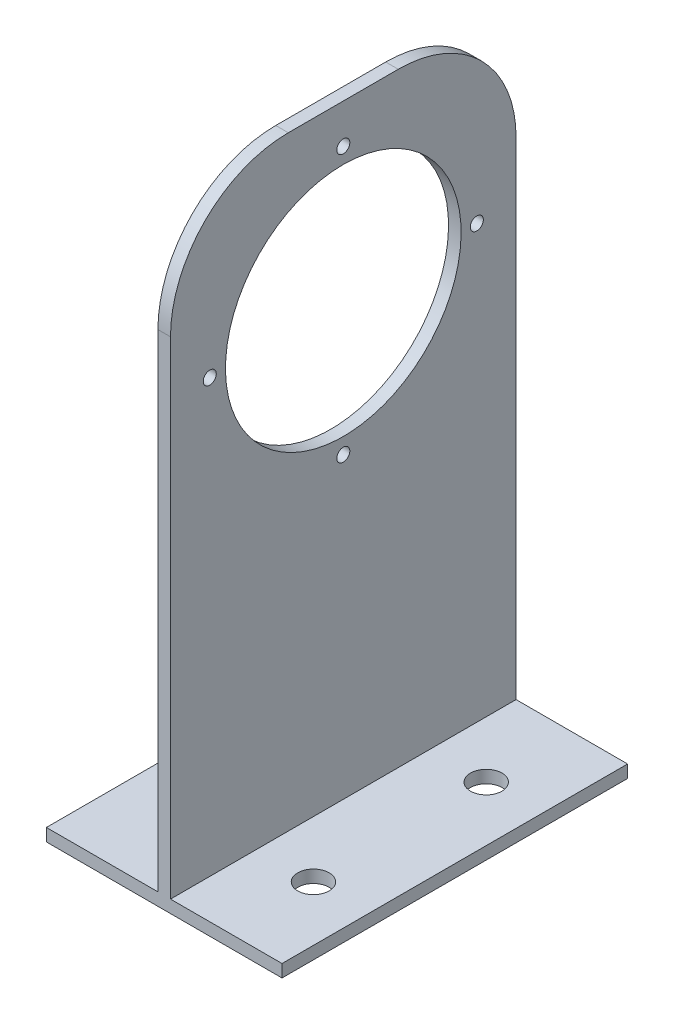
ISO-10303-21;
HEADER;
FILE_DESCRIPTION(('STEP AP214'),'2;1');
FILE_NAME('part.step','',(''),(''),'','','');
FILE_SCHEMA(('AUTOMOTIVE_DESIGN { 1 0 10303 214 1 1 1 1 }'));
ENDSEC;
DATA;
#1=APPLICATION_CONTEXT('core data for automotive mechanical design processes');
#2=APPLICATION_PROTOCOL_DEFINITION('international standard','automotive_design',2000,#1);
#3=PRODUCT_CONTEXT('',#1,'mechanical');
#4=PRODUCT('Part','Part','',(#3));
#5=PRODUCT_RELATED_PRODUCT_CATEGORY('part','',(#4));
#6=PRODUCT_DEFINITION_FORMATION('','',#4);
#7=PRODUCT_DEFINITION_CONTEXT('part definition',#1,'design');
#8=PRODUCT_DEFINITION('design','',#6,#7);
#9=PRODUCT_DEFINITION_SHAPE('','',#8);
#10=(LENGTH_UNIT() NAMED_UNIT(*) SI_UNIT(.MILLI.,.METRE.));
#11=(NAMED_UNIT(*) PLANE_ANGLE_UNIT() SI_UNIT($,.RADIAN.));
#12=(NAMED_UNIT(*) SI_UNIT($,.STERADIAN.) SOLID_ANGLE_UNIT());
#13=UNCERTAINTY_MEASURE_WITH_UNIT(LENGTH_MEASURE(1.E-05),#10,'distance_accuracy_value','');
#14=(GEOMETRIC_REPRESENTATION_CONTEXT(3) GLOBAL_UNCERTAINTY_ASSIGNED_CONTEXT((#13)) GLOBAL_UNIT_ASSIGNED_CONTEXT((#10,
#11,#12)) REPRESENTATION_CONTEXT('',''));
#15=CARTESIAN_POINT('',(0.,0.,0.));
#16=DIRECTION('',(0.,0.,1.));
#17=DIRECTION('',(1.,0.,0.));
#18=AXIS2_PLACEMENT_3D('',#15,#16,#17);
#19=CARTESIAN_POINT('',(3.99999999999999,393.,220.));
#20=DIRECTION('',(0.,-1.,0.));
#21=DIRECTION('',(0.,0.,-1.));
#22=AXIS2_PLACEMENT_3D('',#19,#20,#21);
#23=PLANE('',#22);
#24=DIRECTION('',(0.,0.,-1.));
#25=VECTOR('',#24,1.);
#26=CARTESIAN_POINT('',(3.99999999999999,393.,220.));
#27=LINE('',#26,#25);
#28=CARTESIAN_POINT('',(3.99999999999999,393.,145.));
#29=VERTEX_POINT('',#28);
#30=CARTESIAN_POINT('',(3.99999999999999,393.,75.));
#31=VERTEX_POINT('',#30);
#32=EDGE_CURVE('E164',#29,#31,#27,.T.);
#33=ORIENTED_EDGE('',*,*,#32,.T.);
#34=DIRECTION('',(-1.,0.,0.));
#35=VECTOR('',#34,1.);
#36=CARTESIAN_POINT('',(3.99999999999999,393.,75.));
#37=LINE('',#36,#35);
#38=CARTESIAN_POINT('',(-4.00000000000001,393.,75.));
#39=VERTEX_POINT('',#38);
#40=EDGE_CURVE('E222',#31,#39,#37,.T.);
#41=ORIENTED_EDGE('',*,*,#40,.T.);
#42=DIRECTION('',(0.,0.,-1.));
#43=VECTOR('',#42,1.);
#44=CARTESIAN_POINT('',(-4.00000000000001,393.,220.));
#45=LINE('',#44,#43);
#46=CARTESIAN_POINT('',(-4.00000000000001,393.,145.));
#47=VERTEX_POINT('',#46);
#48=EDGE_CURVE('E139',#47,#39,#45,.T.);
#49=ORIENTED_EDGE('',*,*,#48,.F.);
#50=DIRECTION('',(-1.,0.,0.));
#51=VECTOR('',#50,1.);
#52=CARTESIAN_POINT('',(3.99999999999999,393.,145.));
#53=LINE('',#52,#51);
#54=EDGE_CURVE('E208',#47,#29,#53,.F.);
#55=ORIENTED_EDGE('',*,*,#54,.T.);
#56=EDGE_LOOP('',(#33,#41,#49,#55));
#57=FACE_BOUND('',#56,.T.);
#58=ADVANCED_FACE('F39',(#57),#23,.F.);
#59=CARTESIAN_POINT('',(-4.00000000000001,393.,220.));
#60=DIRECTION('',(1.,0.,0.));
#61=DIRECTION('',(0.,1.,0.));
#62=AXIS2_PLACEMENT_3D('',#59,#60,#61);
#63=PLANE('',#62);
#64=CARTESIAN_POINT('',(-4.00000000000001,368.,110.));
#65=DIRECTION('',(1.,0.,0.));
#66=DIRECTION('',(0.,1.,0.));
#67=AXIS2_PLACEMENT_3D('',#64,#65,#66);
#68=CIRCLE('',#67,4.14999999999996);
#69=CARTESIAN_POINT('',(-4.00000000000001,372.15,110.));
#70=VERTEX_POINT('',#69);
#71=EDGE_CURVE('E340',#70,#70,#68,.T.);
#72=ORIENTED_EDGE('',*,*,#71,.T.);
#73=EDGE_LOOP('',(#72));
#74=FACE_BOUND('',#73,.T.);
#75=CARTESIAN_POINT('',(-4.00000000000002,283.,195.));
#76=DIRECTION('',(1.,0.,0.));
#77=DIRECTION('',(0.,1.,0.));
#78=AXIS2_PLACEMENT_3D('',#75,#76,#77);
#79=CIRCLE('',#78,4.14999999999996);
#80=CARTESIAN_POINT('',(-4.00000000000002,287.15,195.));
#81=VERTEX_POINT('',#80);
#82=EDGE_CURVE('E347',#81,#81,#79,.T.);
#83=ORIENTED_EDGE('',*,*,#82,.T.);
#84=EDGE_LOOP('',(#83));
#85=FACE_BOUND('',#84,.T.);
#86=CARTESIAN_POINT('',(-4.00000000000002,198.,110.));
#87=DIRECTION('',(1.,0.,0.));
#88=DIRECTION('',(0.,1.,0.));
#89=AXIS2_PLACEMENT_3D('',#86,#87,#88);
#90=CIRCLE('',#89,4.14999999999996);
#91=CARTESIAN_POINT('',(-4.00000000000002,202.15,110.));
#92=VERTEX_POINT('',#91);
#93=EDGE_CURVE('E358',#92,#92,#90,.T.);
#94=ORIENTED_EDGE('',*,*,#93,.T.);
#95=EDGE_LOOP('',(#94));
#96=FACE_BOUND('',#95,.T.);
#97=CARTESIAN_POINT('',(-4.00000000000002,283.,25.));
#98=DIRECTION('',(1.,0.,0.));
#99=DIRECTION('',(0.,1.,0.));
#100=AXIS2_PLACEMENT_3D('',#97,#98,#99);
#101=CIRCLE('',#100,4.14999999999996);
#102=CARTESIAN_POINT('',(-4.00000000000002,287.15,25.));
#103=VERTEX_POINT('',#102);
#104=EDGE_CURVE('E366',#103,#103,#101,.T.);
#105=ORIENTED_EDGE('',*,*,#104,.T.);
#106=EDGE_LOOP('',(#105));
#107=FACE_BOUND('',#106,.T.);
#108=CARTESIAN_POINT('',(-4.00000000000003,283.,110.));
#109=DIRECTION('',(1.,0.,0.));
#110=DIRECTION('',(0.,1.,0.));
#111=AXIS2_PLACEMENT_3D('',#108,#109,#110);
#112=CIRCLE('',#111,75.);
#113=CARTESIAN_POINT('',(-4.00000000000002,358.,110.));
#114=VERTEX_POINT('',#113);
#115=EDGE_CURVE('E374',#114,#114,#112,.T.);
#116=ORIENTED_EDGE('',*,*,#115,.T.);
#117=EDGE_LOOP('',(#116));
#118=FACE_BOUND('',#117,.T.);
#119=ORIENTED_EDGE('',*,*,#48,.T.);
#120=CARTESIAN_POINT('',(-4.00000000000002,318.,75.));
#121=DIRECTION('',(1.,0.,0.));
#122=DIRECTION('',(0.,1.,0.));
#123=AXIS2_PLACEMENT_3D('',#120,#121,#122);
#124=CIRCLE('',#123,75.);
#125=CARTESIAN_POINT('',(-4.00000000000002,318.,0.));
#126=VERTEX_POINT('',#125);
#127=EDGE_CURVE('E229',#39,#126,#124,.F.);
#128=ORIENTED_EDGE('',*,*,#127,.T.);
#129=DIRECTION('',(0.,-1.,0.));
#130=VECTOR('',#129,1.);
#131=CARTESIAN_POINT('',(-4.00000000000001,393.,0.));
#132=LINE('',#131,#130);
#133=CARTESIAN_POINT('',(-4.00000000000004,8.,0.));
#134=VERTEX_POINT('',#133);
#135=EDGE_CURVE('E135',#126,#134,#132,.T.);
#136=ORIENTED_EDGE('',*,*,#135,.T.);
#137=DIRECTION('',(0.,0.,-1.));
#138=VECTOR('',#137,1.);
#139=CARTESIAN_POINT('',(-4.00000000000004,8.,220.));
#140=LINE('',#139,#138);
#141=CARTESIAN_POINT('',(-4.00000000000004,8.,220.));
#142=VERTEX_POINT('',#141);
#143=EDGE_CURVE('E132',#142,#134,#140,.T.);
#144=ORIENTED_EDGE('',*,*,#143,.F.);
#145=DIRECTION('',(0.,-1.,0.));
#146=VECTOR('',#145,1.);
#147=CARTESIAN_POINT('',(-4.00000000000001,393.,220.));
#148=LINE('',#147,#146);
#149=CARTESIAN_POINT('',(-4.00000000000002,318.,220.));
#150=VERTEX_POINT('',#149);
#151=EDGE_CURVE('E120',#150,#142,#148,.T.);
#152=ORIENTED_EDGE('',*,*,#151,.F.);
#153=CARTESIAN_POINT('',(-4.00000000000002,318.,145.));
#154=DIRECTION('',(1.,0.,0.));
#155=DIRECTION('',(0.,1.,0.));
#156=AXIS2_PLACEMENT_3D('',#153,#154,#155);
#157=CIRCLE('',#156,75.);
#158=EDGE_CURVE('E226',#150,#47,#157,.F.);
#159=ORIENTED_EDGE('',*,*,#158,.T.);
#160=EDGE_LOOP('',(#119,#128,#136,#144,#152,#159));
#161=FACE_BOUND('',#160,.T.);
#162=ADVANCED_FACE('F134',(#74,#85,#96,#107,#118,#161),#63,.F.);
#163=CARTESIAN_POINT('',(-4.00000000000004,8.,220.));
#164=DIRECTION('',(0.,-1.,0.));
#165=DIRECTION('',(1.,0.,0.));
#166=AXIS2_PLACEMENT_3D('',#163,#164,#165);
#167=PLANE('',#166);
#168=CARTESIAN_POINT('',(-40.,7.99999999999999,165.));
#169=DIRECTION('',(0.,-1.,0.));
#170=DIRECTION('',(1.,0.,0.));
#171=AXIS2_PLACEMENT_3D('',#168,#169,#170);
#172=CIRCLE('',#171,9.99999999999994);
#173=CARTESIAN_POINT('',(-30.0000000000001,8.,165.));
#174=VERTEX_POINT('',#173);
#175=EDGE_CURVE('E387',#174,#174,#172,.T.);
#176=ORIENTED_EDGE('',*,*,#175,.T.);
#177=EDGE_LOOP('',(#176));
#178=FACE_BOUND('',#177,.T.);
#179=CARTESIAN_POINT('',(-40.,7.99999999999999,55.));
#180=DIRECTION('',(0.,-1.,0.));
#181=DIRECTION('',(1.,0.,0.));
#182=AXIS2_PLACEMENT_3D('',#179,#180,#181);
#183=CIRCLE('',#182,9.99999999999994);
#184=CARTESIAN_POINT('',(-30.,8.,55.));
#185=VERTEX_POINT('',#184);
#186=EDGE_CURVE('E168',#185,#185,#183,.T.);
#187=ORIENTED_EDGE('',*,*,#186,.T.);
#188=EDGE_LOOP('',(#187));
#189=FACE_BOUND('',#188,.T.);
#190=DIRECTION('',(-1.,0.,0.));
#191=VECTOR('',#190,1.);
#192=CARTESIAN_POINT('',(-4.00000000000004,8.,0.));
#193=LINE('',#192,#191);
#194=CARTESIAN_POINT('',(-75.,7.99999999999999,0.));
#195=VERTEX_POINT('',#194);
#196=EDGE_CURVE('E167',#134,#195,#193,.T.);
#197=ORIENTED_EDGE('',*,*,#196,.T.);
#198=DIRECTION('',(0.,0.,-1.));
#199=VECTOR('',#198,1.);
#200=CARTESIAN_POINT('',(-75.,7.99999999999999,220.));
#201=LINE('',#200,#199);
#202=CARTESIAN_POINT('',(-75.,7.99999999999999,220.));
#203=VERTEX_POINT('',#202);
#204=EDGE_CURVE('E140',#203,#195,#201,.T.);
#205=ORIENTED_EDGE('',*,*,#204,.F.);
#206=DIRECTION('',(-1.,0.,0.));
#207=VECTOR('',#206,1.);
#208=CARTESIAN_POINT('',(-4.00000000000004,8.,220.));
#209=LINE('',#208,#207);
#210=EDGE_CURVE('E124',#142,#203,#209,.T.);
#211=ORIENTED_EDGE('',*,*,#210,.F.);
#212=ORIENTED_EDGE('',*,*,#143,.T.);
#213=EDGE_LOOP('',(#197,#205,#211,#212));
#214=FACE_BOUND('',#213,.T.);
#215=ADVANCED_FACE('F142',(#178,#189,#214),#167,.F.);
#216=CARTESIAN_POINT('',(-75.,7.99999999999999,220.));
#217=DIRECTION('',(1.,0.,0.));
#218=DIRECTION('',(0.,1.,0.));
#219=AXIS2_PLACEMENT_3D('',#216,#217,#218);
#220=PLANE('',#219);
#221=DIRECTION('',(0.,-1.,0.));
#222=VECTOR('',#221,1.);
#223=CARTESIAN_POINT('',(-75.,7.99999999999999,0.));
#224=LINE('',#223,#222);
#225=CARTESIAN_POINT('',(-75.,0.,0.));
#226=VERTEX_POINT('',#225);
#227=EDGE_CURVE('E171',#195,#226,#224,.T.);
#228=ORIENTED_EDGE('',*,*,#227,.T.);
#229=DIRECTION('',(0.,0.,-1.));
#230=VECTOR('',#229,1.);
#231=CARTESIAN_POINT('',(-75.,0.,220.));
#232=LINE('',#231,#230);
#233=CARTESIAN_POINT('',(-75.,0.,220.));
#234=VERTEX_POINT('',#233);
#235=EDGE_CURVE('E200',#234,#226,#232,.T.);
#236=ORIENTED_EDGE('',*,*,#235,.F.);
#237=DIRECTION('',(0.,-1.,0.));
#238=VECTOR('',#237,1.);
#239=CARTESIAN_POINT('',(-75.,7.99999999999999,220.));
#240=LINE('',#239,#238);
#241=EDGE_CURVE('E146',#203,#234,#240,.T.);
#242=ORIENTED_EDGE('',*,*,#241,.F.);
#243=ORIENTED_EDGE('',*,*,#204,.T.);
#244=EDGE_LOOP('',(#228,#236,#242,#243));
#245=FACE_BOUND('',#244,.T.);
#246=ADVANCED_FACE('F248',(#245),#220,.F.);
#247=CARTESIAN_POINT('',(-75.,0.,220.));
#248=DIRECTION('',(0.,1.,0.));
#249=DIRECTION('',(-1.,0.,0.));
#250=AXIS2_PLACEMENT_3D('',#247,#248,#249);
#251=PLANE('',#250);
#252=CARTESIAN_POINT('',(40.,0.,55.));
#253=DIRECTION('',(0.,-1.,0.));
#254=DIRECTION('',(0.,0.,-1.));
#255=AXIS2_PLACEMENT_3D('',#252,#253,#254);
#256=CIRCLE('',#255,9.99999999999996);
#257=CARTESIAN_POINT('',(40.,0.,45.0000000000001));
#258=VERTEX_POINT('',#257);
#259=EDGE_CURVE('E219',#258,#258,#256,.T.);
#260=ORIENTED_EDGE('',*,*,#259,.F.);
#261=EDGE_LOOP('',(#260));
#262=FACE_BOUND('',#261,.T.);
#263=CARTESIAN_POINT('',(40.,0.,165.));
#264=DIRECTION('',(0.,-1.,0.));
#265=DIRECTION('',(0.,0.,-1.));
#266=AXIS2_PLACEMENT_3D('',#263,#264,#265);
#267=CIRCLE('',#266,9.99999999999996);
#268=CARTESIAN_POINT('',(40.,0.,155.));
#269=VERTEX_POINT('',#268);
#270=EDGE_CURVE('E214',#269,#269,#267,.T.);
#271=ORIENTED_EDGE('',*,*,#270,.F.);
#272=EDGE_LOOP('',(#271));
#273=FACE_BOUND('',#272,.T.);
#274=CARTESIAN_POINT('',(-40.,0.,165.));
#275=DIRECTION('',(0.,-1.,0.));
#276=DIRECTION('',(0.,0.,-1.));
#277=AXIS2_PLACEMENT_3D('',#274,#275,#276);
#278=CIRCLE('',#277,9.99999999999996);
#279=CARTESIAN_POINT('',(-40.,0.,155.));
#280=VERTEX_POINT('',#279);
#281=EDGE_CURVE('E213',#280,#280,#278,.T.);
#282=ORIENTED_EDGE('',*,*,#281,.F.);
#283=EDGE_LOOP('',(#282));
#284=FACE_BOUND('',#283,.T.);
#285=CARTESIAN_POINT('',(-40.,0.,55.));
#286=DIRECTION('',(0.,-1.,0.));
#287=DIRECTION('',(0.,0.,-1.));
#288=AXIS2_PLACEMENT_3D('',#285,#286,#287);
#289=CIRCLE('',#288,9.99999999999996);
#290=CARTESIAN_POINT('',(-40.,0.,45.));
#291=VERTEX_POINT('',#290);
#292=EDGE_CURVE('E391',#291,#291,#289,.T.);
#293=ORIENTED_EDGE('',*,*,#292,.F.);
#294=EDGE_LOOP('',(#293));
#295=FACE_BOUND('',#294,.T.);
#296=DIRECTION('',(1.,0.,0.));
#297=VECTOR('',#296,1.);
#298=CARTESIAN_POINT('',(-75.,0.,0.));
#299=LINE('',#298,#297);
#300=CARTESIAN_POINT('',(75.,0.,0.));
#301=VERTEX_POINT('',#300);
#302=EDGE_CURVE('E174',#226,#301,#299,.T.);
#303=ORIENTED_EDGE('',*,*,#302,.T.);
#304=DIRECTION('',(0.,0.,-1.));
#305=VECTOR('',#304,1.);
#306=CARTESIAN_POINT('',(75.,0.,220.));
#307=LINE('',#306,#305);
#308=CARTESIAN_POINT('',(75.,0.,220.));
#309=VERTEX_POINT('',#308);
#310=EDGE_CURVE('E196',#309,#301,#307,.T.);
#311=ORIENTED_EDGE('',*,*,#310,.F.);
#312=DIRECTION('',(1.,0.,0.));
#313=VECTOR('',#312,1.);
#314=CARTESIAN_POINT('',(-75.,0.,220.));
#315=LINE('',#314,#313);
#316=EDGE_CURVE('E149',#234,#309,#315,.T.);
#317=ORIENTED_EDGE('',*,*,#316,.F.);
#318=ORIENTED_EDGE('',*,*,#235,.T.);
#319=EDGE_LOOP('',(#303,#311,#317,#318));
#320=FACE_BOUND('',#319,.T.);
#321=ADVANCED_FACE('F255',(#262,#273,#284,#295,#320),#251,.F.);
#322=CARTESIAN_POINT('',(75.,0.,220.));
#323=DIRECTION('',(-1.,0.,0.));
#324=DIRECTION('',(0.,0.,1.));
#325=AXIS2_PLACEMENT_3D('',#322,#323,#324);
#326=PLANE('',#325);
#327=DIRECTION('',(0.,1.,0.));
#328=VECTOR('',#327,1.);
#329=CARTESIAN_POINT('',(75.,0.,0.));
#330=LINE('',#329,#328);
#331=CARTESIAN_POINT('',(75.,7.99999999999997,0.));
#332=VERTEX_POINT('',#331);
#333=EDGE_CURVE('E177',#301,#332,#330,.T.);
#334=ORIENTED_EDGE('',*,*,#333,.T.);
#335=DIRECTION('',(0.,0.,-1.));
#336=VECTOR('',#335,1.);
#337=CARTESIAN_POINT('',(75.,7.99999999999997,220.));
#338=LINE('',#337,#336);
#339=CARTESIAN_POINT('',(75.,7.99999999999997,220.));
#340=VERTEX_POINT('',#339);
#341=EDGE_CURVE('E192',#340,#332,#338,.T.);
#342=ORIENTED_EDGE('',*,*,#341,.F.);
#343=DIRECTION('',(0.,1.,0.));
#344=VECTOR('',#343,1.);
#345=CARTESIAN_POINT('',(75.,0.,220.));
#346=LINE('',#345,#344);
#347=EDGE_CURVE('E155',#309,#340,#346,.T.);
#348=ORIENTED_EDGE('',*,*,#347,.F.);
#349=ORIENTED_EDGE('',*,*,#310,.T.);
#350=EDGE_LOOP('',(#334,#342,#348,#349));
#351=FACE_BOUND('',#350,.T.);
#352=ADVANCED_FACE('F258',(#351),#326,.F.);
#353=CARTESIAN_POINT('',(75.,7.99999999999997,220.));
#354=DIRECTION('',(0.,-1.,0.));
#355=DIRECTION('',(1.,0.,0.));
#356=AXIS2_PLACEMENT_3D('',#353,#354,#355);
#357=PLANE('',#356);
#358=CARTESIAN_POINT('',(40.,7.99999999999998,55.));
#359=DIRECTION('',(0.,-1.,0.));
#360=DIRECTION('',(1.,0.,0.));
#361=AXIS2_PLACEMENT_3D('',#358,#359,#360);
#362=CIRCLE('',#361,9.99999999999994);
#363=CARTESIAN_POINT('',(49.9999999999999,7.99999999999998,55.));
#364=VERTEX_POINT('',#363);
#365=EDGE_CURVE('E215',#364,#364,#362,.T.);
#366=ORIENTED_EDGE('',*,*,#365,.T.);
#367=EDGE_LOOP('',(#366));
#368=FACE_BOUND('',#367,.T.);
#369=CARTESIAN_POINT('',(40.,7.99999999999998,165.));
#370=DIRECTION('',(0.,-1.,0.));
#371=DIRECTION('',(1.,0.,0.));
#372=AXIS2_PLACEMENT_3D('',#369,#370,#371);
#373=CIRCLE('',#372,9.99999999999994);
#374=CARTESIAN_POINT('',(49.9999999999999,7.99999999999998,165.));
#375=VERTEX_POINT('',#374);
#376=EDGE_CURVE('E209',#375,#375,#373,.T.);
#377=ORIENTED_EDGE('',*,*,#376,.T.);
#378=EDGE_LOOP('',(#377));
#379=FACE_BOUND('',#378,.T.);
#380=DIRECTION('',(-1.,0.,0.));
#381=VECTOR('',#380,1.);
#382=CARTESIAN_POINT('',(75.,7.99999999999997,0.));
#383=LINE('',#382,#381);
#384=CARTESIAN_POINT('',(4.00000000000004,8.,0.));
#385=VERTEX_POINT('',#384);
#386=EDGE_CURVE('E180',#332,#385,#383,.T.);
#387=ORIENTED_EDGE('',*,*,#386,.T.);
#388=DIRECTION('',(0.,0.,-1.));
#389=VECTOR('',#388,1.);
#390=CARTESIAN_POINT('',(4.00000000000004,8.,220.));
#391=LINE('',#390,#389);
#392=CARTESIAN_POINT('',(4.00000000000004,8.,220.));
#393=VERTEX_POINT('',#392);
#394=EDGE_CURVE('E188',#393,#385,#391,.T.);
#395=ORIENTED_EDGE('',*,*,#394,.F.);
#396=DIRECTION('',(-1.,0.,0.));
#397=VECTOR('',#396,1.);
#398=CARTESIAN_POINT('',(75.,7.99999999999997,220.));
#399=LINE('',#398,#397);
#400=EDGE_CURVE('E158',#340,#393,#399,.T.);
#401=ORIENTED_EDGE('',*,*,#400,.F.);
#402=ORIENTED_EDGE('',*,*,#341,.T.);
#403=EDGE_LOOP('',(#387,#395,#401,#402));
#404=FACE_BOUND('',#403,.T.);
#405=ADVANCED_FACE('F263',(#368,#379,#404),#357,.F.);
#406=CARTESIAN_POINT('',(4.00000000000004,8.,220.));
#407=DIRECTION('',(-1.,0.,0.));
#408=DIRECTION('',(0.,-1.,0.));
#409=AXIS2_PLACEMENT_3D('',#406,#407,#408);
#410=PLANE('',#409);
#411=CARTESIAN_POINT('',(3.99999999999999,368.,110.));
#412=DIRECTION('',(1.,0.,0.));
#413=DIRECTION('',(0.,0.,-1.));
#414=AXIS2_PLACEMENT_3D('',#411,#412,#413);
#415=CIRCLE('',#414,4.14999999999999);
#416=CARTESIAN_POINT('',(3.99999999999999,368.,105.85));
#417=VERTEX_POINT('',#416);
#418=EDGE_CURVE('E337',#417,#417,#415,.T.);
#419=ORIENTED_EDGE('',*,*,#418,.F.);
#420=EDGE_LOOP('',(#419));
#421=FACE_BOUND('',#420,.T.);
#422=CARTESIAN_POINT('',(4.,283.,195.));
#423=DIRECTION('',(1.,0.,0.));
#424=DIRECTION('',(0.,0.,-1.));
#425=AXIS2_PLACEMENT_3D('',#422,#423,#424);
#426=CIRCLE('',#425,4.14999999999999);
#427=CARTESIAN_POINT('',(4.,283.,190.85));
#428=VERTEX_POINT('',#427);
#429=EDGE_CURVE('E342',#428,#428,#426,.T.);
#430=ORIENTED_EDGE('',*,*,#429,.F.);
#431=EDGE_LOOP('',(#430));
#432=FACE_BOUND('',#431,.T.);
#433=CARTESIAN_POINT('',(4.00000000000002,198.,110.));
#434=DIRECTION('',(1.,0.,0.));
#435=DIRECTION('',(0.,0.,-1.));
#436=AXIS2_PLACEMENT_3D('',#433,#434,#435);
#437=CIRCLE('',#436,4.14999999999996);
#438=CARTESIAN_POINT('',(4.00000000000002,198.,105.85));
#439=VERTEX_POINT('',#438);
#440=EDGE_CURVE('E354',#439,#439,#437,.T.);
#441=ORIENTED_EDGE('',*,*,#440,.F.);
#442=EDGE_LOOP('',(#441));
#443=FACE_BOUND('',#442,.T.);
#444=CARTESIAN_POINT('',(4.,283.,25.));
#445=DIRECTION('',(1.,0.,0.));
#446=DIRECTION('',(0.,0.,-1.));
#447=AXIS2_PLACEMENT_3D('',#444,#445,#446);
#448=CIRCLE('',#447,4.14999999999999);
#449=CARTESIAN_POINT('',(4.,283.,20.85));
#450=VERTEX_POINT('',#449);
#451=EDGE_CURVE('E362',#450,#450,#448,.T.);
#452=ORIENTED_EDGE('',*,*,#451,.F.);
#453=EDGE_LOOP('',(#452));
#454=FACE_BOUND('',#453,.T.);
#455=CARTESIAN_POINT('',(4.,283.,110.));
#456=DIRECTION('',(1.,0.,0.));
#457=DIRECTION('',(0.,1.,0.));
#458=AXIS2_PLACEMENT_3D('',#455,#456,#457);
#459=CIRCLE('',#458,75.);
#460=CARTESIAN_POINT('',(3.99999999999999,358.,110.));
#461=VERTEX_POINT('',#460);
#462=EDGE_CURVE('E370',#461,#461,#459,.T.);
#463=ORIENTED_EDGE('',*,*,#462,.F.);
#464=EDGE_LOOP('',(#463));
#465=FACE_BOUND('',#464,.T.);
#466=DIRECTION('',(0.,1.,0.));
#467=VECTOR('',#466,1.);
#468=CARTESIAN_POINT('',(4.00000000000004,8.,0.));
#469=LINE('',#468,#467);
#470=CARTESIAN_POINT('',(4.,318.,0.));
#471=VERTEX_POINT('',#470);
#472=EDGE_CURVE('E129',#385,#471,#469,.T.);
#473=ORIENTED_EDGE('',*,*,#472,.T.);
#474=CARTESIAN_POINT('',(4.,318.,75.));
#475=DIRECTION('',(-1.,0.,0.));
#476=DIRECTION('',(0.,-1.,0.));
#477=AXIS2_PLACEMENT_3D('',#474,#475,#476);
#478=CIRCLE('',#477,75.);
#479=EDGE_CURVE('E48',#471,#31,#478,.F.);
#480=ORIENTED_EDGE('',*,*,#479,.T.);
#481=ORIENTED_EDGE('',*,*,#32,.F.);
#482=CARTESIAN_POINT('',(4.,318.,145.));
#483=DIRECTION('',(-1.,0.,0.));
#484=DIRECTION('',(0.,-1.,0.));
#485=AXIS2_PLACEMENT_3D('',#482,#483,#484);
#486=CIRCLE('',#485,75.);
#487=CARTESIAN_POINT('',(4.,318.,220.));
#488=VERTEX_POINT('',#487);
#489=EDGE_CURVE('E55',#29,#488,#486,.F.);
#490=ORIENTED_EDGE('',*,*,#489,.T.);
#491=DIRECTION('',(0.,1.,0.));
#492=VECTOR('',#491,1.);
#493=CARTESIAN_POINT('',(4.00000000000004,8.,220.));
#494=LINE('',#493,#492);
#495=EDGE_CURVE('E161',#393,#488,#494,.T.);
#496=ORIENTED_EDGE('',*,*,#495,.F.);
#497=ORIENTED_EDGE('',*,*,#394,.T.);
#498=EDGE_LOOP('',(#473,#480,#481,#490,#496,#497));
#499=FACE_BOUND('',#498,.T.);
#500=ADVANCED_FACE('F237',(#421,#432,#443,#454,#465,#499),#410,.F.);
#501=CARTESIAN_POINT('',(0.,0.,220.));
#502=DIRECTION('',(0.,0.,1.));
#503=DIRECTION('',(1.,0.,0.));
#504=AXIS2_PLACEMENT_3D('',#501,#502,#503);
#505=PLANE('',#504);
#506=ORIENTED_EDGE('',*,*,#495,.T.);
#507=DIRECTION('',(-1.,0.,0.));
#508=VECTOR('',#507,1.);
#509=CARTESIAN_POINT('',(-4.00000000000001,318.,220.));
#510=LINE('',#509,#508);
#511=EDGE_CURVE('E11',#488,#150,#510,.T.);
#512=ORIENTED_EDGE('',*,*,#511,.T.);
#513=ORIENTED_EDGE('',*,*,#151,.T.);
#514=ORIENTED_EDGE('',*,*,#210,.T.);
#515=ORIENTED_EDGE('',*,*,#241,.T.);
#516=ORIENTED_EDGE('',*,*,#316,.T.);
#517=ORIENTED_EDGE('',*,*,#347,.T.);
#518=ORIENTED_EDGE('',*,*,#400,.T.);
#519=EDGE_LOOP('',(#506,#512,#513,#514,#515,#516,#517,#518));
#520=FACE_BOUND('',#519,.T.);
#521=ADVANCED_FACE('F122',(#520),#505,.T.);
#522=CARTESIAN_POINT('',(0.,0.,0.));
#523=DIRECTION('',(0.,0.,1.));
#524=DIRECTION('',(1.,0.,0.));
#525=AXIS2_PLACEMENT_3D('',#522,#523,#524);
#526=PLANE('',#525);
#527=ORIENTED_EDGE('',*,*,#135,.F.);
#528=DIRECTION('',(-1.,0.,0.));
#529=VECTOR('',#528,1.);
#530=CARTESIAN_POINT('',(0.,318.,0.));
#531=LINE('',#530,#529);
#532=EDGE_CURVE('E63',#126,#471,#531,.F.);
#533=ORIENTED_EDGE('',*,*,#532,.T.);
#534=ORIENTED_EDGE('',*,*,#472,.F.);
#535=ORIENTED_EDGE('',*,*,#386,.F.);
#536=ORIENTED_EDGE('',*,*,#333,.F.);
#537=ORIENTED_EDGE('',*,*,#302,.F.);
#538=ORIENTED_EDGE('',*,*,#227,.F.);
#539=ORIENTED_EDGE('',*,*,#196,.F.);
#540=EDGE_LOOP('',(#527,#533,#534,#535,#536,#537,#538,#539));
#541=FACE_BOUND('',#540,.T.);
#542=ADVANCED_FACE('F244',(#541),#526,.F.);
#543=CARTESIAN_POINT('',(-40.,0.,55.));
#544=DIRECTION('',(0.,-1.,0.));
#545=DIRECTION('',(0.,0.,-1.));
#546=AXIS2_PLACEMENT_3D('',#543,#544,#545);
#547=CYLINDRICAL_SURFACE('',#546,9.99999999999994);
#548=ORIENTED_EDGE('',*,*,#292,.T.);
#549=EDGE_LOOP('',(#548));
#550=FACE_BOUND('',#549,.T.);
#551=ORIENTED_EDGE('',*,*,#186,.F.);
#552=EDGE_LOOP('',(#551));
#553=FACE_BOUND('',#552,.T.);
#554=ADVANCED_FACE('F301',(#550,#553),#547,.F.);
#555=CARTESIAN_POINT('',(-40.,0.,165.));
#556=DIRECTION('',(0.,-1.,0.));
#557=DIRECTION('',(0.,0.,-1.));
#558=AXIS2_PLACEMENT_3D('',#555,#556,#557);
#559=CYLINDRICAL_SURFACE('',#558,9.99999999999994);
#560=ORIENTED_EDGE('',*,*,#281,.T.);
#561=EDGE_LOOP('',(#560));
#562=FACE_BOUND('',#561,.T.);
#563=ORIENTED_EDGE('',*,*,#175,.F.);
#564=EDGE_LOOP('',(#563));
#565=FACE_BOUND('',#564,.T.);
#566=ADVANCED_FACE('F306',(#562,#565),#559,.F.);
#567=CARTESIAN_POINT('',(40.,0.,165.));
#568=DIRECTION('',(0.,-1.,0.));
#569=DIRECTION('',(0.,0.,-1.));
#570=AXIS2_PLACEMENT_3D('',#567,#568,#569);
#571=CYLINDRICAL_SURFACE('',#570,9.99999999999994);
#572=ORIENTED_EDGE('',*,*,#270,.T.);
#573=EDGE_LOOP('',(#572));
#574=FACE_BOUND('',#573,.T.);
#575=ORIENTED_EDGE('',*,*,#376,.F.);
#576=EDGE_LOOP('',(#575));
#577=FACE_BOUND('',#576,.T.);
#578=ADVANCED_FACE('F310',(#574,#577),#571,.F.);
#579=CARTESIAN_POINT('',(40.,0.,55.));
#580=DIRECTION('',(0.,-1.,0.));
#581=DIRECTION('',(0.,0.,-1.));
#582=AXIS2_PLACEMENT_3D('',#579,#580,#581);
#583=CYLINDRICAL_SURFACE('',#582,9.99999999999994);
#584=ORIENTED_EDGE('',*,*,#259,.T.);
#585=EDGE_LOOP('',(#584));
#586=FACE_BOUND('',#585,.T.);
#587=ORIENTED_EDGE('',*,*,#365,.F.);
#588=EDGE_LOOP('',(#587));
#589=FACE_BOUND('',#588,.T.);
#590=ADVANCED_FACE('F274',(#586,#589),#583,.F.);
#591=CARTESIAN_POINT('',(3.99999999999999,318.,75.));
#592=DIRECTION('',(-1.,0.,0.));
#593=DIRECTION('',(0.,0.,1.));
#594=AXIS2_PLACEMENT_3D('',#591,#592,#593);
#595=CYLINDRICAL_SURFACE('',#594,75.);
#596=ORIENTED_EDGE('',*,*,#479,.F.);
#597=ORIENTED_EDGE('',*,*,#532,.F.);
#598=ORIENTED_EDGE('',*,*,#127,.F.);
#599=ORIENTED_EDGE('',*,*,#40,.F.);
#600=EDGE_LOOP('',(#596,#597,#598,#599));
#601=FACE_BOUND('',#600,.T.);
#602=ADVANCED_FACE('F243',(#601),#595,.T.);
#603=CARTESIAN_POINT('',(0.,318.,145.));
#604=DIRECTION('',(1.,0.,0.));
#605=DIRECTION('',(0.,0.,-1.));
#606=AXIS2_PLACEMENT_3D('',#603,#604,#605);
#607=CYLINDRICAL_SURFACE('',#606,75.);
#608=ORIENTED_EDGE('',*,*,#489,.F.);
#609=ORIENTED_EDGE('',*,*,#54,.F.);
#610=ORIENTED_EDGE('',*,*,#158,.F.);
#611=ORIENTED_EDGE('',*,*,#511,.F.);
#612=EDGE_LOOP('',(#608,#609,#610,#611));
#613=FACE_BOUND('',#612,.T.);
#614=ADVANCED_FACE('F41',(#613),#607,.T.);
#615=CARTESIAN_POINT('',(-75.,283.,110.));
#616=DIRECTION('',(1.,0.,0.));
#617=DIRECTION('',(0.,1.,0.));
#618=AXIS2_PLACEMENT_3D('',#615,#616,#617);
#619=CYLINDRICAL_SURFACE('',#618,75.);
#620=CARTESIAN_POINT('',(3.99999999999999,358.,110.));
#621=CARTESIAN_POINT('',(3.91666666666666,358.,110.));
#622=CARTESIAN_POINT('',(3.83333333333332,358.,110.));
#623=CARTESIAN_POINT('',(3.66666666666666,358.,110.));
#624=CARTESIAN_POINT('',(3.58333333333332,358.,110.));
#625=CARTESIAN_POINT('',(3.41666666666666,358.,110.));
#626=CARTESIAN_POINT('',(3.33333333333332,358.,110.));
#627=CARTESIAN_POINT('',(3.16666666666666,358.,110.));
#628=CARTESIAN_POINT('',(3.08333333333332,358.,110.));
#629=CARTESIAN_POINT('',(2.91666666666666,358.,110.));
#630=CARTESIAN_POINT('',(2.83333333333332,358.,110.));
#631=CARTESIAN_POINT('',(2.66666666666666,358.,110.));
#632=CARTESIAN_POINT('',(2.58333333333332,358.,110.));
#633=CARTESIAN_POINT('',(2.41666666666665,358.,110.));
#634=CARTESIAN_POINT('',(2.33333333333332,358.,110.));
#635=CARTESIAN_POINT('',(2.16666666666665,358.,110.));
#636=CARTESIAN_POINT('',(2.08333333333332,358.,110.));
#637=CARTESIAN_POINT('',(1.91666666666665,358.,110.));
#638=CARTESIAN_POINT('',(1.83333333333332,358.,110.));
#639=CARTESIAN_POINT('',(1.66666666666665,358.,110.));
#640=CARTESIAN_POINT('',(1.58333333333332,358.,110.));
#641=CARTESIAN_POINT('',(1.41666666666665,358.,110.));
#642=CARTESIAN_POINT('',(1.33333333333332,358.,110.));
#643=CARTESIAN_POINT('',(1.16666666666665,358.,110.));
#644=CARTESIAN_POINT('',(1.08333333333332,358.,110.));
#645=CARTESIAN_POINT('',(0.916666666666654,358.,110.));
#646=CARTESIAN_POINT('',(0.83333333333332,358.,110.));
#647=CARTESIAN_POINT('',(0.666666666666653,358.,110.));
#648=CARTESIAN_POINT('',(0.58333333333332,358.,110.));
#649=CARTESIAN_POINT('',(0.416666666666653,358.,110.));
#650=CARTESIAN_POINT('',(0.33333333333332,358.,110.));
#651=CARTESIAN_POINT('',(0.166666666666653,358.,110.));
#652=CARTESIAN_POINT('',(0.0833333333333195,358.,110.));
#653=CARTESIAN_POINT('',(-0.0833333333333473,358.,110.));
#654=CARTESIAN_POINT('',(-0.166666666666681,358.,110.));
#655=CARTESIAN_POINT('',(-0.333333333333348,358.,110.));
#656=CARTESIAN_POINT('',(-0.416666666666681,358.,110.));
#657=CARTESIAN_POINT('',(-0.583333333333348,358.,110.));
#658=CARTESIAN_POINT('',(-0.666666666666681,358.,110.));
#659=CARTESIAN_POINT('',(-0.833333333333348,358.,110.));
#660=CARTESIAN_POINT('',(-0.916666666666681,358.,110.));
#661=CARTESIAN_POINT('',(-1.08333333333335,358.,110.));
#662=CARTESIAN_POINT('',(-1.16666666666668,358.,110.));
#663=CARTESIAN_POINT('',(-1.33333333333335,358.,110.));
#664=CARTESIAN_POINT('',(-1.41666666666668,358.,110.));
#665=CARTESIAN_POINT('',(-1.58333333333335,358.,110.));
#666=CARTESIAN_POINT('',(-1.66666666666668,358.,110.));
#667=CARTESIAN_POINT('',(-1.83333333333335,358.,110.));
#668=CARTESIAN_POINT('',(-1.91666666666668,358.,110.));
#669=CARTESIAN_POINT('',(-2.08333333333335,358.,110.));
#670=CARTESIAN_POINT('',(-2.16666666666668,358.,110.));
#671=CARTESIAN_POINT('',(-2.33333333333335,358.,110.));
#672=CARTESIAN_POINT('',(-2.41666666666668,358.,110.));
#673=CARTESIAN_POINT('',(-2.58333333333335,358.,110.));
#674=CARTESIAN_POINT('',(-2.66666666666668,358.,110.));
#675=CARTESIAN_POINT('',(-2.83333333333335,358.,110.));
#676=CARTESIAN_POINT('',(-2.91666666666668,358.,110.));
#677=CARTESIAN_POINT('',(-3.08333333333335,358.,110.));
#678=CARTESIAN_POINT('',(-3.16666666666668,358.,110.));
#679=CARTESIAN_POINT('',(-3.33333333333335,358.,110.));
#680=CARTESIAN_POINT('',(-3.41666666666668,358.,110.));
#681=CARTESIAN_POINT('',(-3.58333333333335,358.,110.));
#682=CARTESIAN_POINT('',(-3.66666666666668,358.,110.));
#683=CARTESIAN_POINT('',(-3.83333333333335,358.,110.));
#684=CARTESIAN_POINT('',(-3.91666666666668,358.,110.));
#685=CARTESIAN_POINT('',(-4.00000000000002,358.,110.));
#686=B_SPLINE_CURVE_WITH_KNOTS('',3,(#620,#621,#622,#623,#624,#625,#626,#627,#628,#629,#630,
#631,#632,#633,#634,#635,#636,#637,#638,#639,#640,#641,#642,#643,#644,#645,#646,#647,#648,#649,
#650,#651,#652,#653,#654,#655,#656,#657,#658,#659,#660,#661,#662,#663,#664,#665,#666,#667,#668,
#669,#670,#671,#672,#673,#674,#675,#676,#677,#678,#679,#680,#681,#682,#683,#684,#685),
.UNSPECIFIED.,.F.,.F.,(4,2,2,2,2,2,2,2,2,2,2,2,2,2,2,2,2,2,2,2,2,2,2,2,2,2,2,2,2,2,2,2,4),(0.,
0.25,0.5,0.750000000000001,1.,1.25,1.5,1.75,2.,2.25,2.5,2.75,3.,3.25,3.5,3.75,4.,4.25,4.5,4.75,
5.,5.25,5.50000000000001,5.75000000000001,6.00000000000001,6.25000000000001,6.50000000000001,
6.75000000000001,7.00000000000001,7.25000000000001,7.50000000000001,7.75000000000001,
8.00000000000001),.UNSPECIFIED.);
#687=EDGE_CURVE('BSEAM266',#461,#114,#686,.T.);
#688=ORIENTED_EDGE('',*,*,#462,.T.);
#689=ORIENTED_EDGE('',*,*,#115,.F.);
#690=ORIENTED_EDGE('',*,*,#687,.T.);
#691=ORIENTED_EDGE('',*,*,#687,.F.);
#692=EDGE_LOOP('',(#688,#690,#689,#691));
#693=FACE_BOUND('',#692,.T.);
#694=ADVANCED_FACE('F266',(#693),#619,.F.);
#695=CARTESIAN_POINT('',(4.,283.,25.));
#696=DIRECTION('',(1.,0.,0.));
#697=DIRECTION('',(0.,0.,-1.));
#698=AXIS2_PLACEMENT_3D('',#695,#696,#697);
#699=CYLINDRICAL_SURFACE('',#698,4.14999999999996);
#700=ORIENTED_EDGE('',*,*,#451,.T.);
#701=EDGE_LOOP('',(#700));
#702=FACE_BOUND('',#701,.T.);
#703=ORIENTED_EDGE('',*,*,#104,.F.);
#704=EDGE_LOOP('',(#703));
#705=FACE_BOUND('',#704,.T.);
#706=ADVANCED_FACE('F271',(#702,#705),#699,.F.);
#707=CARTESIAN_POINT('',(4.00000000000001,198.,110.));
#708=DIRECTION('',(1.,0.,0.));
#709=DIRECTION('',(0.,0.,-1.));
#710=AXIS2_PLACEMENT_3D('',#707,#708,#709);
#711=CYLINDRICAL_SURFACE('',#710,4.14999999999996);
#712=ORIENTED_EDGE('',*,*,#440,.T.);
#713=EDGE_LOOP('',(#712));
#714=FACE_BOUND('',#713,.T.);
#715=ORIENTED_EDGE('',*,*,#93,.F.);
#716=EDGE_LOOP('',(#715));
#717=FACE_BOUND('',#716,.T.);
#718=ADVANCED_FACE('F320',(#714,#717),#711,.F.);
#719=CARTESIAN_POINT('',(4.,283.,195.));
#720=DIRECTION('',(1.,0.,0.));
#721=DIRECTION('',(0.,0.,-1.));
#722=AXIS2_PLACEMENT_3D('',#719,#720,#721);
#723=CYLINDRICAL_SURFACE('',#722,4.14999999999996);
#724=ORIENTED_EDGE('',*,*,#429,.T.);
#725=EDGE_LOOP('',(#724));
#726=FACE_BOUND('',#725,.T.);
#727=ORIENTED_EDGE('',*,*,#82,.F.);
#728=EDGE_LOOP('',(#727));
#729=FACE_BOUND('',#728,.T.);
#730=ADVANCED_FACE('F324',(#726,#729),#723,.F.);
#731=CARTESIAN_POINT('',(3.99999999999999,368.,110.));
#732=DIRECTION('',(1.,0.,0.));
#733=DIRECTION('',(0.,0.,-1.));
#734=AXIS2_PLACEMENT_3D('',#731,#732,#733);
#735=CYLINDRICAL_SURFACE('',#734,4.14999999999996);
#736=ORIENTED_EDGE('',*,*,#418,.T.);
#737=EDGE_LOOP('',(#736));
#738=FACE_BOUND('',#737,.T.);
#739=ORIENTED_EDGE('',*,*,#71,.F.);
#740=EDGE_LOOP('',(#739));
#741=FACE_BOUND('',#740,.T.);
#742=ADVANCED_FACE('F328',(#738,#741),#735,.F.);
#743=CLOSED_SHELL('',(#58,#162,#215,#246,#321,#352,#405,#500,#521,#542,#554,#566,#578,#590,#602,
#614,#694,#706,#718,#730,#742));
#744=MANIFOLD_SOLID_BREP('B2',#743);
#745=ADVANCED_BREP_SHAPE_REPRESENTATION('',(#18,#744),#14);
#746=SHAPE_DEFINITION_REPRESENTATION(#9,#745);
ENDSEC;
END-ISO-10303-21;
